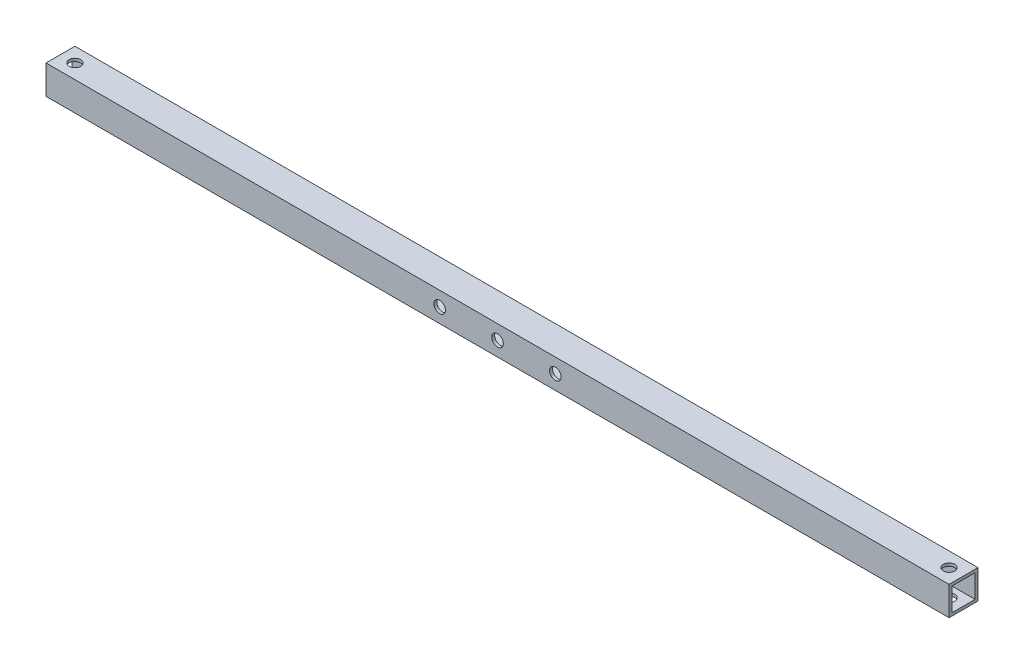
ISO-10303-21;
HEADER;
FILE_DESCRIPTION(('STEP AP214'),'2;1');
FILE_NAME('part.step','',(''),(''),'','','');
FILE_SCHEMA(('AUTOMOTIVE_DESIGN { 1 0 10303 214 1 1 1 1 }'));
ENDSEC;
DATA;
#1=APPLICATION_CONTEXT('core data for automotive mechanical design processes');
#2=APPLICATION_PROTOCOL_DEFINITION('international standard','automotive_design',2000,#1);
#3=PRODUCT_CONTEXT('',#1,'mechanical');
#4=PRODUCT('Part','Part','',(#3));
#5=PRODUCT_RELATED_PRODUCT_CATEGORY('part','',(#4));
#6=PRODUCT_DEFINITION_FORMATION('','',#4);
#7=PRODUCT_DEFINITION_CONTEXT('part definition',#1,'design');
#8=PRODUCT_DEFINITION('design','',#6,#7);
#9=PRODUCT_DEFINITION_SHAPE('','',#8);
#10=(LENGTH_UNIT() NAMED_UNIT(*) SI_UNIT(.MILLI.,.METRE.));
#11=(NAMED_UNIT(*) PLANE_ANGLE_UNIT() SI_UNIT($,.RADIAN.));
#12=(NAMED_UNIT(*) SI_UNIT($,.STERADIAN.) SOLID_ANGLE_UNIT());
#13=UNCERTAINTY_MEASURE_WITH_UNIT(LENGTH_MEASURE(1.E-05),#10,'distance_accuracy_value','');
#14=(GEOMETRIC_REPRESENTATION_CONTEXT(3) GLOBAL_UNCERTAINTY_ASSIGNED_CONTEXT((#13)) GLOBAL_UNIT_ASSIGNED_CONTEXT((#10,
#11,#12)) REPRESENTATION_CONTEXT('',''));
#15=CARTESIAN_POINT('',(0.,0.,0.));
#16=DIRECTION('',(0.,0.,1.));
#17=DIRECTION('',(1.,0.,0.));
#18=AXIS2_PLACEMENT_3D('',#15,#16,#17);
#19=CARTESIAN_POINT('',(312.,0.,0.));
#20=DIRECTION('',(1.,0.,0.));
#21=DIRECTION('',(0.,0.,-1.));
#22=AXIS2_PLACEMENT_3D('',#19,#20,#21);
#23=PLANE('',#22);
#24=DIRECTION('',(0.,1.,0.));
#25=VECTOR('',#24,1.);
#26=CARTESIAN_POINT('',(312.,5.,-5.));
#27=LINE('',#26,#25);
#28=CARTESIAN_POINT('',(312.,-5.,-5.));
#29=VERTEX_POINT('',#28);
#30=CARTESIAN_POINT('',(312.,5.,-5.));
#31=VERTEX_POINT('',#30);
#32=EDGE_CURVE('E181',#29,#31,#27,.T.);
#33=ORIENTED_EDGE('',*,*,#32,.T.);
#34=DIRECTION('',(0.,0.,1.));
#35=VECTOR('',#34,1.);
#36=CARTESIAN_POINT('',(312.,5.,5.));
#37=LINE('',#36,#35);
#38=CARTESIAN_POINT('',(312.,5.,5.));
#39=VERTEX_POINT('',#38);
#40=EDGE_CURVE('E185',#31,#39,#37,.T.);
#41=ORIENTED_EDGE('',*,*,#40,.T.);
#42=DIRECTION('',(0.,-1.,0.));
#43=VECTOR('',#42,1.);
#44=CARTESIAN_POINT('',(312.,5.,5.));
#45=LINE('',#44,#43);
#46=CARTESIAN_POINT('',(312.,-5.,5.));
#47=VERTEX_POINT('',#46);
#48=EDGE_CURVE('E189',#39,#47,#45,.T.);
#49=ORIENTED_EDGE('',*,*,#48,.T.);
#50=DIRECTION('',(0.,0.,-1.));
#51=VECTOR('',#50,1.);
#52=CARTESIAN_POINT('',(312.,-5.,5.));
#53=LINE('',#52,#51);
#54=EDGE_CURVE('E192',#47,#29,#53,.T.);
#55=ORIENTED_EDGE('',*,*,#54,.T.);
#56=EDGE_LOOP('',(#33,#41,#49,#55));
#57=FACE_BOUND('',#56,.T.);
#58=DIRECTION('',(0.,0.,1.));
#59=VECTOR('',#58,1.);
#60=CARTESIAN_POINT('',(312.,4.,5.));
#61=LINE('',#60,#59);
#62=CARTESIAN_POINT('',(312.,4.,-4.));
#63=VERTEX_POINT('',#62);
#64=CARTESIAN_POINT('',(312.,4.,4.));
#65=VERTEX_POINT('',#64);
#66=EDGE_CURVE('E140',#63,#65,#61,.T.);
#67=ORIENTED_EDGE('',*,*,#66,.F.);
#68=DIRECTION('',(0.,1.,0.));
#69=VECTOR('',#68,1.);
#70=CARTESIAN_POINT('',(312.,5.,-4.));
#71=LINE('',#70,#69);
#72=CARTESIAN_POINT('',(312.,-4.,-4.));
#73=VERTEX_POINT('',#72);
#74=EDGE_CURVE('E131',#73,#63,#71,.T.);
#75=ORIENTED_EDGE('',*,*,#74,.F.);
#76=DIRECTION('',(0.,0.,-1.));
#77=VECTOR('',#76,1.);
#78=CARTESIAN_POINT('',(312.,-4.,5.));
#79=LINE('',#78,#77);
#80=CARTESIAN_POINT('',(312.,-4.,4.));
#81=VERTEX_POINT('',#80);
#82=EDGE_CURVE('E157',#81,#73,#79,.T.);
#83=ORIENTED_EDGE('',*,*,#82,.F.);
#84=DIRECTION('',(0.,-1.,0.));
#85=VECTOR('',#84,1.);
#86=CARTESIAN_POINT('',(312.,5.,4.));
#87=LINE('',#86,#85);
#88=EDGE_CURVE('E153',#65,#81,#87,.T.);
#89=ORIENTED_EDGE('',*,*,#88,.F.);
#90=EDGE_LOOP('',(#67,#75,#83,#89));
#91=FACE_BOUND('',#90,.T.);
#92=ADVANCED_FACE('F63',(#57,#91),#23,.T.);
#93=CARTESIAN_POINT('',(0.,0.,0.));
#94=DIRECTION('',(1.,0.,0.));
#95=DIRECTION('',(0.,0.,-1.));
#96=AXIS2_PLACEMENT_3D('',#93,#94,#95);
#97=PLANE('',#96);
#98=DIRECTION('',(0.,1.,0.));
#99=VECTOR('',#98,1.);
#100=CARTESIAN_POINT('',(0.,5.,-5.));
#101=LINE('',#100,#99);
#102=CARTESIAN_POINT('',(0.,-5.,-5.));
#103=VERTEX_POINT('',#102);
#104=CARTESIAN_POINT('',(0.,5.,-5.));
#105=VERTEX_POINT('',#104);
#106=EDGE_CURVE('E149',#103,#105,#101,.T.);
#107=ORIENTED_EDGE('',*,*,#106,.F.);
#108=DIRECTION('',(0.,0.,-1.));
#109=VECTOR('',#108,1.);
#110=CARTESIAN_POINT('',(0.,-5.,5.));
#111=LINE('',#110,#109);
#112=CARTESIAN_POINT('',(0.,-5.,5.));
#113=VERTEX_POINT('',#112);
#114=EDGE_CURVE('E186',#113,#103,#111,.T.);
#115=ORIENTED_EDGE('',*,*,#114,.F.);
#116=DIRECTION('',(0.,-1.,0.));
#117=VECTOR('',#116,1.);
#118=CARTESIAN_POINT('',(0.,5.,5.));
#119=LINE('',#118,#117);
#120=CARTESIAN_POINT('',(0.,5.,5.));
#121=VERTEX_POINT('',#120);
#122=EDGE_CURVE('E202',#121,#113,#119,.T.);
#123=ORIENTED_EDGE('',*,*,#122,.F.);
#124=DIRECTION('',(0.,0.,1.));
#125=VECTOR('',#124,1.);
#126=CARTESIAN_POINT('',(0.,5.,5.));
#127=LINE('',#126,#125);
#128=EDGE_CURVE('E199',#105,#121,#127,.T.);
#129=ORIENTED_EDGE('',*,*,#128,.F.);
#130=EDGE_LOOP('',(#107,#115,#123,#129));
#131=FACE_BOUND('',#130,.T.);
#132=DIRECTION('',(0.,1.,0.));
#133=VECTOR('',#132,1.);
#134=CARTESIAN_POINT('',(0.,5.,-4.));
#135=LINE('',#134,#133);
#136=CARTESIAN_POINT('',(0.,-4.,-4.));
#137=VERTEX_POINT('',#136);
#138=CARTESIAN_POINT('',(0.,4.,-4.));
#139=VERTEX_POINT('',#138);
#140=EDGE_CURVE('E89',#137,#139,#135,.T.);
#141=ORIENTED_EDGE('',*,*,#140,.T.);
#142=DIRECTION('',(0.,0.,1.));
#143=VECTOR('',#142,1.);
#144=CARTESIAN_POINT('',(0.,4.,5.));
#145=LINE('',#144,#143);
#146=CARTESIAN_POINT('',(0.,4.,4.));
#147=VERTEX_POINT('',#146);
#148=EDGE_CURVE('E147',#139,#147,#145,.T.);
#149=ORIENTED_EDGE('',*,*,#148,.T.);
#150=DIRECTION('',(0.,-1.,0.));
#151=VECTOR('',#150,1.);
#152=CARTESIAN_POINT('',(0.,5.,4.));
#153=LINE('',#152,#151);
#154=CARTESIAN_POINT('',(0.,-4.,4.));
#155=VERTEX_POINT('',#154);
#156=EDGE_CURVE('E168',#147,#155,#153,.T.);
#157=ORIENTED_EDGE('',*,*,#156,.T.);
#158=DIRECTION('',(0.,0.,-1.));
#159=VECTOR('',#158,1.);
#160=CARTESIAN_POINT('',(0.,-4.,5.));
#161=LINE('',#160,#159);
#162=EDGE_CURVE('E141',#155,#137,#161,.T.);
#163=ORIENTED_EDGE('',*,*,#162,.T.);
#164=EDGE_LOOP('',(#141,#149,#157,#163));
#165=FACE_BOUND('',#164,.T.);
#166=ADVANCED_FACE('F306',(#131,#165),#97,.F.);
#167=CARTESIAN_POINT('',(312.,5.,-5.));
#168=DIRECTION('',(0.,0.,1.));
#169=DIRECTION('',(0.,-1.,0.));
#170=AXIS2_PLACEMENT_3D('',#167,#168,#169);
#171=PLANE('',#170);
#172=CARTESIAN_POINT('',(136.,0.,-5.));
#173=DIRECTION('',(0.,0.,1.));
#174=DIRECTION('',(1.,0.,0.));
#175=AXIS2_PLACEMENT_3D('',#172,#173,#174);
#176=CIRCLE('',#175,2.);
#177=CARTESIAN_POINT('',(138.,0.,-5.));
#178=VERTEX_POINT('',#177);
#179=EDGE_CURVE('E231',#178,#178,#176,.T.);
#180=ORIENTED_EDGE('',*,*,#179,.T.);
#181=EDGE_LOOP('',(#180));
#182=FACE_BOUND('',#181,.T.);
#183=CARTESIAN_POINT('',(156.,0.,-5.));
#184=DIRECTION('',(0.,0.,1.));
#185=DIRECTION('',(1.,0.,0.));
#186=AXIS2_PLACEMENT_3D('',#183,#184,#185);
#187=CIRCLE('',#186,2.);
#188=CARTESIAN_POINT('',(158.,0.,-5.));
#189=VERTEX_POINT('',#188);
#190=EDGE_CURVE('E348',#189,#189,#187,.T.);
#191=ORIENTED_EDGE('',*,*,#190,.T.);
#192=EDGE_LOOP('',(#191));
#193=FACE_BOUND('',#192,.T.);
#194=CARTESIAN_POINT('',(176.,0.,-5.));
#195=DIRECTION('',(0.,0.,1.));
#196=DIRECTION('',(1.,0.,0.));
#197=AXIS2_PLACEMENT_3D('',#194,#195,#196);
#198=CIRCLE('',#197,2.);
#199=CARTESIAN_POINT('',(178.,0.,-5.));
#200=VERTEX_POINT('',#199);
#201=EDGE_CURVE('E342',#200,#200,#198,.T.);
#202=ORIENTED_EDGE('',*,*,#201,.T.);
#203=EDGE_LOOP('',(#202));
#204=FACE_BOUND('',#203,.T.);
#205=ORIENTED_EDGE('',*,*,#106,.T.);
#206=DIRECTION('',(-1.,0.,0.));
#207=VECTOR('',#206,1.);
#208=CARTESIAN_POINT('',(312.,5.,-5.));
#209=LINE('',#208,#207);
#210=EDGE_CURVE('E12',#31,#105,#209,.T.);
#211=ORIENTED_EDGE('',*,*,#210,.F.);
#212=ORIENTED_EDGE('',*,*,#32,.F.);
#213=DIRECTION('',(-1.,0.,0.));
#214=VECTOR('',#213,1.);
#215=CARTESIAN_POINT('',(312.,-5.,-5.));
#216=LINE('',#215,#214);
#217=EDGE_CURVE('E195',#29,#103,#216,.T.);
#218=ORIENTED_EDGE('',*,*,#217,.T.);
#219=EDGE_LOOP('',(#205,#211,#212,#218));
#220=FACE_BOUND('',#219,.T.);
#221=ADVANCED_FACE('F65',(#182,#193,#204,#220),#171,.F.);
#222=CARTESIAN_POINT('',(312.,5.,5.));
#223=DIRECTION('',(0.,-1.,0.));
#224=DIRECTION('',(0.,0.,-1.));
#225=AXIS2_PLACEMENT_3D('',#222,#223,#224);
#226=PLANE('',#225);
#227=CARTESIAN_POINT('',(5.,5.,0.));
#228=DIRECTION('',(0.,1.,0.));
#229=DIRECTION('',(0.,0.,1.));
#230=AXIS2_PLACEMENT_3D('',#227,#228,#229);
#231=CIRCLE('',#230,2.);
#232=CARTESIAN_POINT('',(5.,5.,2.));
#233=VERTEX_POINT('',#232);
#234=EDGE_CURVE('E258',#233,#233,#231,.T.);
#235=ORIENTED_EDGE('',*,*,#234,.F.);
#236=EDGE_LOOP('',(#235));
#237=FACE_BOUND('',#236,.T.);
#238=CARTESIAN_POINT('',(307.,5.,0.));
#239=DIRECTION('',(0.,1.,0.));
#240=DIRECTION('',(0.,0.,-1.));
#241=AXIS2_PLACEMENT_3D('',#238,#239,#240);
#242=CIRCLE('',#241,2.);
#243=CARTESIAN_POINT('',(307.,5.,-2.00000000000003));
#244=VERTEX_POINT('',#243);
#245=EDGE_CURVE('E254',#244,#244,#242,.T.);
#246=ORIENTED_EDGE('',*,*,#245,.F.);
#247=EDGE_LOOP('',(#246));
#248=FACE_BOUND('',#247,.T.);
#249=ORIENTED_EDGE('',*,*,#128,.T.);
#250=DIRECTION('',(-1.,0.,0.));
#251=VECTOR('',#250,1.);
#252=CARTESIAN_POINT('',(312.,5.,5.));
#253=LINE('',#252,#251);
#254=EDGE_CURVE('E73',#39,#121,#253,.T.);
#255=ORIENTED_EDGE('',*,*,#254,.F.);
#256=ORIENTED_EDGE('',*,*,#40,.F.);
#257=ORIENTED_EDGE('',*,*,#210,.T.);
#258=EDGE_LOOP('',(#249,#255,#256,#257));
#259=FACE_BOUND('',#258,.T.);
#260=ADVANCED_FACE('F292',(#237,#248,#259),#226,.F.);
#261=CARTESIAN_POINT('',(312.,5.,5.));
#262=DIRECTION('',(0.,0.,-1.));
#263=DIRECTION('',(0.,1.,0.));
#264=AXIS2_PLACEMENT_3D('',#261,#262,#263);
#265=PLANE('',#264);
#266=CARTESIAN_POINT('',(136.,0.,5.));
#267=DIRECTION('',(0.,0.,1.));
#268=DIRECTION('',(1.,0.,0.));
#269=AXIS2_PLACEMENT_3D('',#266,#267,#268);
#270=CIRCLE('',#269,2.);
#271=CARTESIAN_POINT('',(138.,0.,5.));
#272=VERTEX_POINT('',#271);
#273=EDGE_CURVE('E333',#272,#272,#270,.T.);
#274=ORIENTED_EDGE('',*,*,#273,.F.);
#275=EDGE_LOOP('',(#274));
#276=FACE_BOUND('',#275,.T.);
#277=CARTESIAN_POINT('',(156.,0.,5.));
#278=DIRECTION('',(0.,0.,1.));
#279=DIRECTION('',(1.,0.,0.));
#280=AXIS2_PLACEMENT_3D('',#277,#278,#279);
#281=CIRCLE('',#280,2.);
#282=CARTESIAN_POINT('',(158.,0.,5.));
#283=VERTEX_POINT('',#282);
#284=EDGE_CURVE('E337',#283,#283,#281,.T.);
#285=ORIENTED_EDGE('',*,*,#284,.F.);
#286=EDGE_LOOP('',(#285));
#287=FACE_BOUND('',#286,.T.);
#288=CARTESIAN_POINT('',(176.,0.,5.));
#289=DIRECTION('',(0.,0.,1.));
#290=DIRECTION('',(1.,0.,0.));
#291=AXIS2_PLACEMENT_3D('',#288,#289,#290);
#292=CIRCLE('',#291,2.);
#293=CARTESIAN_POINT('',(178.,0.,5.));
#294=VERTEX_POINT('',#293);
#295=EDGE_CURVE('E247',#294,#294,#292,.T.);
#296=ORIENTED_EDGE('',*,*,#295,.F.);
#297=EDGE_LOOP('',(#296));
#298=FACE_BOUND('',#297,.T.);
#299=ORIENTED_EDGE('',*,*,#122,.T.);
#300=DIRECTION('',(-1.,0.,0.));
#301=VECTOR('',#300,1.);
#302=CARTESIAN_POINT('',(312.,-5.,5.));
#303=LINE('',#302,#301);
#304=EDGE_CURVE('E210',#47,#113,#303,.T.);
#305=ORIENTED_EDGE('',*,*,#304,.F.);
#306=ORIENTED_EDGE('',*,*,#48,.F.);
#307=ORIENTED_EDGE('',*,*,#254,.T.);
#308=EDGE_LOOP('',(#299,#305,#306,#307));
#309=FACE_BOUND('',#308,.T.);
#310=ADVANCED_FACE('F295',(#276,#287,#298,#309),#265,.F.);
#311=CARTESIAN_POINT('',(312.,-5.,5.));
#312=DIRECTION('',(0.,1.,0.));
#313=DIRECTION('',(0.,0.,1.));
#314=AXIS2_PLACEMENT_3D('',#311,#312,#313);
#315=PLANE('',#314);
#316=CARTESIAN_POINT('',(5.,-5.,0.));
#317=DIRECTION('',(0.,1.,0.));
#318=DIRECTION('',(0.,0.,1.));
#319=AXIS2_PLACEMENT_3D('',#316,#317,#318);
#320=CIRCLE('',#319,2.);
#321=CARTESIAN_POINT('',(5.,-5.,2.));
#322=VERTEX_POINT('',#321);
#323=EDGE_CURVE('E222',#322,#322,#320,.T.);
#324=ORIENTED_EDGE('',*,*,#323,.T.);
#325=EDGE_LOOP('',(#324));
#326=FACE_BOUND('',#325,.T.);
#327=CARTESIAN_POINT('',(307.,-5.,0.));
#328=DIRECTION('',(0.,1.,0.));
#329=DIRECTION('',(0.,0.,-1.));
#330=AXIS2_PLACEMENT_3D('',#327,#328,#329);
#331=CIRCLE('',#330,2.);
#332=CARTESIAN_POINT('',(307.,-5.,-2.00000000000003));
#333=VERTEX_POINT('',#332);
#334=EDGE_CURVE('E262',#333,#333,#331,.T.);
#335=ORIENTED_EDGE('',*,*,#334,.T.);
#336=EDGE_LOOP('',(#335));
#337=FACE_BOUND('',#336,.T.);
#338=ORIENTED_EDGE('',*,*,#114,.T.);
#339=ORIENTED_EDGE('',*,*,#217,.F.);
#340=ORIENTED_EDGE('',*,*,#54,.F.);
#341=ORIENTED_EDGE('',*,*,#304,.T.);
#342=EDGE_LOOP('',(#338,#339,#340,#341));
#343=FACE_BOUND('',#342,.T.);
#344=ADVANCED_FACE('F310',(#326,#337,#343),#315,.F.);
#345=CARTESIAN_POINT('',(312.,5.,-4.));
#346=DIRECTION('',(0.,0.,1.));
#347=DIRECTION('',(0.,-1.,0.));
#348=AXIS2_PLACEMENT_3D('',#345,#346,#347);
#349=PLANE('',#348);
#350=CARTESIAN_POINT('',(136.,0.,-4.));
#351=DIRECTION('',(0.,0.,1.));
#352=DIRECTION('',(0.,-1.,0.));
#353=AXIS2_PLACEMENT_3D('',#350,#351,#352);
#354=CIRCLE('',#353,2.);
#355=CARTESIAN_POINT('',(136.,-2.,-4.));
#356=VERTEX_POINT('',#355);
#357=EDGE_CURVE('E250',#356,#356,#354,.T.);
#358=ORIENTED_EDGE('',*,*,#357,.F.);
#359=EDGE_LOOP('',(#358));
#360=FACE_BOUND('',#359,.T.);
#361=CARTESIAN_POINT('',(156.,0.,-4.));
#362=DIRECTION('',(0.,0.,1.));
#363=DIRECTION('',(0.,-1.,0.));
#364=AXIS2_PLACEMENT_3D('',#361,#362,#363);
#365=CIRCLE('',#364,2.);
#366=CARTESIAN_POINT('',(156.,-2.,-4.));
#367=VERTEX_POINT('',#366);
#368=EDGE_CURVE('E235',#367,#367,#365,.T.);
#369=ORIENTED_EDGE('',*,*,#368,.F.);
#370=EDGE_LOOP('',(#369));
#371=FACE_BOUND('',#370,.T.);
#372=CARTESIAN_POINT('',(176.,0.,-4.));
#373=DIRECTION('',(0.,0.,1.));
#374=DIRECTION('',(0.,-1.,0.));
#375=AXIS2_PLACEMENT_3D('',#372,#373,#374);
#376=CIRCLE('',#375,2.);
#377=CARTESIAN_POINT('',(176.,-1.99999999999999,-4.));
#378=VERTEX_POINT('',#377);
#379=EDGE_CURVE('E230',#378,#378,#376,.T.);
#380=ORIENTED_EDGE('',*,*,#379,.F.);
#381=EDGE_LOOP('',(#380));
#382=FACE_BOUND('',#381,.T.);
#383=ORIENTED_EDGE('',*,*,#140,.F.);
#384=DIRECTION('',(-1.,0.,0.));
#385=VECTOR('',#384,1.);
#386=CARTESIAN_POINT('',(312.,-4.,-4.));
#387=LINE('',#386,#385);
#388=EDGE_CURVE('E135',#73,#137,#387,.T.);
#389=ORIENTED_EDGE('',*,*,#388,.F.);
#390=ORIENTED_EDGE('',*,*,#74,.T.);
#391=DIRECTION('',(-1.,0.,0.));
#392=VECTOR('',#391,1.);
#393=CARTESIAN_POINT('',(312.,4.,-4.));
#394=LINE('',#393,#392);
#395=EDGE_CURVE('E134',#63,#139,#394,.T.);
#396=ORIENTED_EDGE('',*,*,#395,.T.);
#397=EDGE_LOOP('',(#383,#389,#390,#396));
#398=FACE_BOUND('',#397,.T.);
#399=ADVANCED_FACE('F133',(#360,#371,#382,#398),#349,.T.);
#400=CARTESIAN_POINT('',(312.,4.,5.));
#401=DIRECTION('',(0.,-1.,0.));
#402=DIRECTION('',(0.,0.,-1.));
#403=AXIS2_PLACEMENT_3D('',#400,#401,#402);
#404=PLANE('',#403);
#405=CARTESIAN_POINT('',(5.,4.,0.));
#406=DIRECTION('',(0.,-1.,0.));
#407=DIRECTION('',(0.,0.,-1.));
#408=AXIS2_PLACEMENT_3D('',#405,#406,#407);
#409=CIRCLE('',#408,2.);
#410=CARTESIAN_POINT('',(5.,4.,-2.));
#411=VERTEX_POINT('',#410);
#412=EDGE_CURVE('E165',#411,#411,#409,.T.);
#413=ORIENTED_EDGE('',*,*,#412,.F.);
#414=EDGE_LOOP('',(#413));
#415=FACE_BOUND('',#414,.T.);
#416=CARTESIAN_POINT('',(307.,4.,0.));
#417=DIRECTION('',(0.,-1.,0.));
#418=DIRECTION('',(0.,0.,-1.));
#419=AXIS2_PLACEMENT_3D('',#416,#417,#418);
#420=CIRCLE('',#419,2.);
#421=CARTESIAN_POINT('',(307.,4.,-2.00000000000003));
#422=VERTEX_POINT('',#421);
#423=EDGE_CURVE('E221',#422,#422,#420,.T.);
#424=ORIENTED_EDGE('',*,*,#423,.F.);
#425=EDGE_LOOP('',(#424));
#426=FACE_BOUND('',#425,.T.);
#427=ORIENTED_EDGE('',*,*,#148,.F.);
#428=ORIENTED_EDGE('',*,*,#395,.F.);
#429=ORIENTED_EDGE('',*,*,#66,.T.);
#430=DIRECTION('',(-1.,0.,0.));
#431=VECTOR('',#430,1.);
#432=CARTESIAN_POINT('',(312.,4.,4.));
#433=LINE('',#432,#431);
#434=EDGE_CURVE('E150',#65,#147,#433,.T.);
#435=ORIENTED_EDGE('',*,*,#434,.T.);
#436=EDGE_LOOP('',(#427,#428,#429,#435));
#437=FACE_BOUND('',#436,.T.);
#438=ADVANCED_FACE('F144',(#415,#426,#437),#404,.T.);
#439=CARTESIAN_POINT('',(312.,5.,4.));
#440=DIRECTION('',(0.,0.,-1.));
#441=DIRECTION('',(0.,1.,0.));
#442=AXIS2_PLACEMENT_3D('',#439,#440,#441);
#443=PLANE('',#442);
#444=CARTESIAN_POINT('',(136.,0.,4.));
#445=DIRECTION('',(0.,0.,-1.));
#446=DIRECTION('',(0.,1.,0.));
#447=AXIS2_PLACEMENT_3D('',#444,#445,#446);
#448=CIRCLE('',#447,2.);
#449=CARTESIAN_POINT('',(136.,2.,4.));
#450=VERTEX_POINT('',#449);
#451=EDGE_CURVE('E67',#450,#450,#448,.T.);
#452=ORIENTED_EDGE('',*,*,#451,.F.);
#453=EDGE_LOOP('',(#452));
#454=FACE_BOUND('',#453,.T.);
#455=CARTESIAN_POINT('',(156.,0.,4.));
#456=DIRECTION('',(0.,0.,-1.));
#457=DIRECTION('',(0.,1.,0.));
#458=AXIS2_PLACEMENT_3D('',#455,#456,#457);
#459=CIRCLE('',#458,2.);
#460=CARTESIAN_POINT('',(156.,2.,4.));
#461=VERTEX_POINT('',#460);
#462=EDGE_CURVE('E232',#461,#461,#459,.T.);
#463=ORIENTED_EDGE('',*,*,#462,.F.);
#464=EDGE_LOOP('',(#463));
#465=FACE_BOUND('',#464,.T.);
#466=CARTESIAN_POINT('',(176.,0.,4.));
#467=DIRECTION('',(0.,0.,-1.));
#468=DIRECTION('',(0.,1.,0.));
#469=AXIS2_PLACEMENT_3D('',#466,#467,#468);
#470=CIRCLE('',#469,2.);
#471=CARTESIAN_POINT('',(176.,2.,4.));
#472=VERTEX_POINT('',#471);
#473=EDGE_CURVE('E227',#472,#472,#470,.T.);
#474=ORIENTED_EDGE('',*,*,#473,.F.);
#475=EDGE_LOOP('',(#474));
#476=FACE_BOUND('',#475,.T.);
#477=ORIENTED_EDGE('',*,*,#156,.F.);
#478=ORIENTED_EDGE('',*,*,#434,.F.);
#479=ORIENTED_EDGE('',*,*,#88,.T.);
#480=DIRECTION('',(-1.,0.,0.));
#481=VECTOR('',#480,1.);
#482=CARTESIAN_POINT('',(312.,-4.,4.));
#483=LINE('',#482,#481);
#484=EDGE_CURVE('E81',#81,#155,#483,.T.);
#485=ORIENTED_EDGE('',*,*,#484,.T.);
#486=EDGE_LOOP('',(#477,#478,#479,#485));
#487=FACE_BOUND('',#486,.T.);
#488=ADVANCED_FACE('F280',(#454,#465,#476,#487),#443,.T.);
#489=CARTESIAN_POINT('',(312.,-4.,5.));
#490=DIRECTION('',(0.,1.,0.));
#491=DIRECTION('',(0.,0.,1.));
#492=AXIS2_PLACEMENT_3D('',#489,#490,#491);
#493=PLANE('',#492);
#494=CARTESIAN_POINT('',(5.,-4.,0.));
#495=DIRECTION('',(0.,1.,0.));
#496=DIRECTION('',(0.,0.,1.));
#497=AXIS2_PLACEMENT_3D('',#494,#495,#496);
#498=CIRCLE('',#497,2.);
#499=CARTESIAN_POINT('',(5.,-4.,2.));
#500=VERTEX_POINT('',#499);
#501=EDGE_CURVE('E223',#500,#500,#498,.T.);
#502=ORIENTED_EDGE('',*,*,#501,.F.);
#503=EDGE_LOOP('',(#502));
#504=FACE_BOUND('',#503,.T.);
#505=CARTESIAN_POINT('',(307.,-4.,0.));
#506=DIRECTION('',(0.,1.,0.));
#507=DIRECTION('',(0.,0.,1.));
#508=AXIS2_PLACEMENT_3D('',#505,#506,#507);
#509=CIRCLE('',#508,2.);
#510=CARTESIAN_POINT('',(307.,-4.,1.99999999999996));
#511=VERTEX_POINT('',#510);
#512=EDGE_CURVE('E217',#511,#511,#509,.T.);
#513=ORIENTED_EDGE('',*,*,#512,.F.);
#514=EDGE_LOOP('',(#513));
#515=FACE_BOUND('',#514,.T.);
#516=ORIENTED_EDGE('',*,*,#162,.F.);
#517=ORIENTED_EDGE('',*,*,#484,.F.);
#518=ORIENTED_EDGE('',*,*,#82,.T.);
#519=ORIENTED_EDGE('',*,*,#388,.T.);
#520=EDGE_LOOP('',(#516,#517,#518,#519));
#521=FACE_BOUND('',#520,.T.);
#522=ADVANCED_FACE('F390',(#504,#515,#521),#493,.T.);
#523=CARTESIAN_POINT('',(307.,-5.,0.));
#524=DIRECTION('',(0.,1.,0.));
#525=DIRECTION('',(0.,0.,1.));
#526=AXIS2_PLACEMENT_3D('',#523,#524,#525);
#527=CYLINDRICAL_SURFACE('',#526,2.);
#528=ORIENTED_EDGE('',*,*,#512,.T.);
#529=EDGE_LOOP('',(#528));
#530=FACE_BOUND('',#529,.T.);
#531=ORIENTED_EDGE('',*,*,#334,.F.);
#532=EDGE_LOOP('',(#531));
#533=FACE_BOUND('',#532,.T.);
#534=ADVANCED_FACE('F289',(#530,#533),#527,.F.);
#535=CARTESIAN_POINT('',(5.,-5.,0.));
#536=DIRECTION('',(0.,1.,0.));
#537=DIRECTION('',(0.,0.,1.));
#538=AXIS2_PLACEMENT_3D('',#535,#536,#537);
#539=CYLINDRICAL_SURFACE('',#538,2.);
#540=ORIENTED_EDGE('',*,*,#501,.T.);
#541=EDGE_LOOP('',(#540));
#542=FACE_BOUND('',#541,.T.);
#543=ORIENTED_EDGE('',*,*,#323,.F.);
#544=EDGE_LOOP('',(#543));
#545=FACE_BOUND('',#544,.T.);
#546=ADVANCED_FACE('F287',(#542,#545),#539,.F.);
#547=ORIENTED_EDGE('',*,*,#423,.T.);
#548=EDGE_LOOP('',(#547));
#549=FACE_BOUND('',#548,.T.);
#550=ORIENTED_EDGE('',*,*,#245,.T.);
#551=EDGE_LOOP('',(#550));
#552=FACE_BOUND('',#551,.T.);
#553=ADVANCED_FACE('F284',(#549,#552),#527,.F.);
#554=ORIENTED_EDGE('',*,*,#412,.T.);
#555=EDGE_LOOP('',(#554));
#556=FACE_BOUND('',#555,.T.);
#557=ORIENTED_EDGE('',*,*,#234,.T.);
#558=EDGE_LOOP('',(#557));
#559=FACE_BOUND('',#558,.T.);
#560=ADVANCED_FACE('F275',(#556,#559),#539,.F.);
#561=CARTESIAN_POINT('',(176.,0.,-5.));
#562=DIRECTION('',(0.,0.,1.));
#563=DIRECTION('',(1.,0.,0.));
#564=AXIS2_PLACEMENT_3D('',#561,#562,#563);
#565=CYLINDRICAL_SURFACE('',#564,2.);
#566=ORIENTED_EDGE('',*,*,#473,.T.);
#567=EDGE_LOOP('',(#566));
#568=FACE_BOUND('',#567,.T.);
#569=ORIENTED_EDGE('',*,*,#295,.T.);
#570=EDGE_LOOP('',(#569));
#571=FACE_BOUND('',#570,.T.);
#572=ADVANCED_FACE('F382',(#568,#571),#565,.F.);
#573=CARTESIAN_POINT('',(156.,0.,-5.));
#574=DIRECTION('',(0.,0.,1.));
#575=DIRECTION('',(1.,0.,0.));
#576=AXIS2_PLACEMENT_3D('',#573,#574,#575);
#577=CYLINDRICAL_SURFACE('',#576,2.);
#578=ORIENTED_EDGE('',*,*,#462,.T.);
#579=EDGE_LOOP('',(#578));
#580=FACE_BOUND('',#579,.T.);
#581=ORIENTED_EDGE('',*,*,#284,.T.);
#582=EDGE_LOOP('',(#581));
#583=FACE_BOUND('',#582,.T.);
#584=ADVANCED_FACE('F374',(#580,#583),#577,.F.);
#585=CARTESIAN_POINT('',(136.,0.,-5.));
#586=DIRECTION('',(0.,0.,1.));
#587=DIRECTION('',(1.,0.,0.));
#588=AXIS2_PLACEMENT_3D('',#585,#586,#587);
#589=CYLINDRICAL_SURFACE('',#588,2.);
#590=ORIENTED_EDGE('',*,*,#451,.T.);
#591=EDGE_LOOP('',(#590));
#592=FACE_BOUND('',#591,.T.);
#593=ORIENTED_EDGE('',*,*,#273,.T.);
#594=EDGE_LOOP('',(#593));
#595=FACE_BOUND('',#594,.T.);
#596=ADVANCED_FACE('F367',(#592,#595),#589,.F.);
#597=ORIENTED_EDGE('',*,*,#379,.T.);
#598=EDGE_LOOP('',(#597));
#599=FACE_BOUND('',#598,.T.);
#600=ORIENTED_EDGE('',*,*,#201,.F.);
#601=EDGE_LOOP('',(#600));
#602=FACE_BOUND('',#601,.T.);
#603=ADVANCED_FACE('F371',(#599,#602),#565,.F.);
#604=ORIENTED_EDGE('',*,*,#368,.T.);
#605=EDGE_LOOP('',(#604));
#606=FACE_BOUND('',#605,.T.);
#607=ORIENTED_EDGE('',*,*,#190,.F.);
#608=EDGE_LOOP('',(#607));
#609=FACE_BOUND('',#608,.T.);
#610=ADVANCED_FACE('F364',(#606,#609),#577,.F.);
#611=ORIENTED_EDGE('',*,*,#357,.T.);
#612=EDGE_LOOP('',(#611));
#613=FACE_BOUND('',#612,.T.);
#614=ORIENTED_EDGE('',*,*,#179,.F.);
#615=EDGE_LOOP('',(#614));
#616=FACE_BOUND('',#615,.T.);
#617=ADVANCED_FACE('F362',(#613,#616),#589,.F.);
#618=CLOSED_SHELL('',(#92,#166,#221,#260,#310,#344,#399,#438,#488,#522,#534,#546,#553,#560,#572,
#584,#596,#603,#610,#617));
#619=MANIFOLD_SOLID_BREP('B2',#618);
#620=ADVANCED_BREP_SHAPE_REPRESENTATION('',(#18,#619),#14);
#621=SHAPE_DEFINITION_REPRESENTATION(#9,#620);
ENDSEC;
END-ISO-10303-21;
